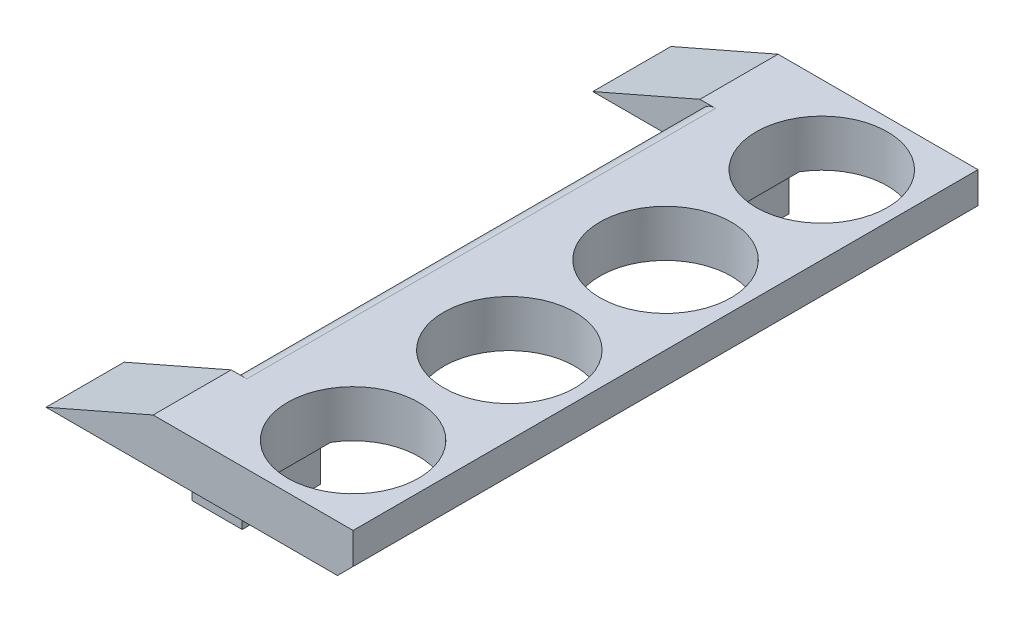
ISO-10303-21;
HEADER;
FILE_DESCRIPTION(('STEP AP214'),'2;1');
FILE_NAME('part.step','',(''),(''),'','','');
FILE_SCHEMA(('AUTOMOTIVE_DESIGN { 1 0 10303 214 1 1 1 1 }'));
ENDSEC;
DATA;
#1=APPLICATION_CONTEXT('core data for automotive mechanical design processes');
#2=APPLICATION_PROTOCOL_DEFINITION('international standard','automotive_design',2000,#1);
#3=PRODUCT_CONTEXT('',#1,'mechanical');
#4=PRODUCT('Part','Part','',(#3));
#5=PRODUCT_RELATED_PRODUCT_CATEGORY('part','',(#4));
#6=PRODUCT_DEFINITION_FORMATION('','',#4);
#7=PRODUCT_DEFINITION_CONTEXT('part definition',#1,'design');
#8=PRODUCT_DEFINITION('design','',#6,#7);
#9=PRODUCT_DEFINITION_SHAPE('','',#8);
#10=(LENGTH_UNIT() NAMED_UNIT(*) SI_UNIT(.MILLI.,.METRE.));
#11=(NAMED_UNIT(*) PLANE_ANGLE_UNIT() SI_UNIT($,.RADIAN.));
#12=(NAMED_UNIT(*) SI_UNIT($,.STERADIAN.) SOLID_ANGLE_UNIT());
#13=UNCERTAINTY_MEASURE_WITH_UNIT(LENGTH_MEASURE(1.E-05),#10,'distance_accuracy_value','');
#14=(GEOMETRIC_REPRESENTATION_CONTEXT(3) GLOBAL_UNCERTAINTY_ASSIGNED_CONTEXT((#13)) GLOBAL_UNIT_ASSIGNED_CONTEXT((#10,
#11,#12)) REPRESENTATION_CONTEXT('',''));
#15=CARTESIAN_POINT('',(0.,0.,0.));
#16=DIRECTION('',(0.,0.,1.));
#17=DIRECTION('',(1.,0.,0.));
#18=AXIS2_PLACEMENT_3D('',#15,#16,#17);
#19=CARTESIAN_POINT('',(0.,0.,0.));
#20=DIRECTION('',(0.,1.,0.));
#21=DIRECTION('',(0.,0.,1.));
#22=AXIS2_PLACEMENT_3D('',#19,#20,#21);
#23=PLANE('',#22);
#24=DIRECTION('',(-1.,0.,0.));
#25=VECTOR('',#24,1.);
#26=CARTESIAN_POINT('',(-32.,0.,-62.5));
#27=LINE('',#26,#25);
#28=CARTESIAN_POINT('',(-10.9999999999999,0.,-62.5));
#29=VERTEX_POINT('',#28);
#30=CARTESIAN_POINT('',(-32.,0.,-62.5));
#31=VERTEX_POINT('',#30);
#32=EDGE_CURVE('E232',#29,#31,#27,.T.);
#33=ORIENTED_EDGE('',*,*,#32,.F.);
#34=DIRECTION('',(0.,0.,-1.));
#35=VECTOR('',#34,1.);
#36=CARTESIAN_POINT('',(-10.9999999999999,0.,-87.5));
#37=LINE('',#36,#35);
#38=CARTESIAN_POINT('',(-10.9999999999999,0.,-64.1833461736079));
#39=VERTEX_POINT('',#38);
#40=EDGE_CURVE('E410',#29,#39,#37,.T.);
#41=ORIENTED_EDGE('',*,*,#40,.T.);
#42=CARTESIAN_POINT('',(6.99999999999999,0.,-75.));
#43=DIRECTION('',(0.,1.,0.));
#44=DIRECTION('',(0.,0.,1.));
#45=AXIS2_PLACEMENT_3D('',#42,#43,#44);
#46=CIRCLE('',#45,21.);
#47=CARTESIAN_POINT('',(27.,0.,-68.5968757625671));
#48=VERTEX_POINT('',#47);
#49=EDGE_CURVE('E286',#39,#48,#46,.T.);
#50=ORIENTED_EDGE('',*,*,#49,.T.);
#51=DIRECTION('',(0.,0.,1.));
#52=VECTOR('',#51,1.);
#53=CARTESIAN_POINT('',(27.,0.,0.));
#54=LINE('',#53,#52);
#55=CARTESIAN_POINT('',(27.,0.,-31.4031242374346));
#56=VERTEX_POINT('',#55);
#57=EDGE_CURVE('E368',#48,#56,#54,.T.);
#58=ORIENTED_EDGE('',*,*,#57,.T.);
#59=CARTESIAN_POINT('',(7.00000000000051,0.,-25.));
#60=DIRECTION('',(0.,1.,0.));
#61=DIRECTION('',(0.,0.,1.));
#62=AXIS2_PLACEMENT_3D('',#59,#60,#61);
#63=CIRCLE('',#62,21.);
#64=CARTESIAN_POINT('',(27.,0.,-18.5968757625655));
#65=VERTEX_POINT('',#64);
#66=EDGE_CURVE('E293',#56,#65,#63,.T.);
#67=ORIENTED_EDGE('',*,*,#66,.T.);
#68=DIRECTION('',(0.,0.,1.));
#69=VECTOR('',#68,1.);
#70=CARTESIAN_POINT('',(27.,0.,0.));
#71=LINE('',#70,#69);
#72=CARTESIAN_POINT('',(27.,0.,18.5968757625638));
#73=VERTEX_POINT('',#72);
#74=EDGE_CURVE('E366',#65,#73,#71,.T.);
#75=ORIENTED_EDGE('',*,*,#74,.T.);
#76=CARTESIAN_POINT('',(7.00000000000103,0.,25.));
#77=DIRECTION('',(0.,1.,0.));
#78=DIRECTION('',(0.,0.,1.));
#79=AXIS2_PLACEMENT_3D('',#76,#77,#78);
#80=CIRCLE('',#79,21.);
#81=CARTESIAN_POINT('',(27.,0.,31.4031242374362));
#82=VERTEX_POINT('',#81);
#83=EDGE_CURVE('E299',#73,#82,#80,.T.);
#84=ORIENTED_EDGE('',*,*,#83,.T.);
#85=DIRECTION('',(0.,0.,1.));
#86=VECTOR('',#85,1.);
#87=CARTESIAN_POINT('',(27.,0.,0.));
#88=LINE('',#87,#86);
#89=CARTESIAN_POINT('',(27.,0.,68.5968757625621));
#90=VERTEX_POINT('',#89);
#91=EDGE_CURVE('E364',#82,#90,#88,.T.);
#92=ORIENTED_EDGE('',*,*,#91,.T.);
#93=CARTESIAN_POINT('',(7.00000000000155,0.,75.));
#94=DIRECTION('',(0.,1.,0.));
#95=DIRECTION('',(0.,0.,1.));
#96=AXIS2_PLACEMENT_3D('',#93,#94,#95);
#97=CIRCLE('',#96,21.);
#98=CARTESIAN_POINT('',(-10.9999999999999,0.,64.1833461736105));
#99=VERTEX_POINT('',#98);
#100=EDGE_CURVE('E305',#90,#99,#97,.T.);
#101=ORIENTED_EDGE('',*,*,#100,.T.);
#102=DIRECTION('',(0.,0.,-1.));
#103=VECTOR('',#102,1.);
#104=CARTESIAN_POINT('',(-10.9999999999999,0.,62.5));
#105=LINE('',#104,#103);
#106=CARTESIAN_POINT('',(-10.9999999999999,0.,62.5));
#107=VERTEX_POINT('',#106);
#108=EDGE_CURVE('E402',#99,#107,#105,.T.);
#109=ORIENTED_EDGE('',*,*,#108,.T.);
#110=DIRECTION('',(1.,0.,0.));
#111=VECTOR('',#110,1.);
#112=CARTESIAN_POINT('',(-32.,0.,62.5));
#113=LINE('',#112,#111);
#114=CARTESIAN_POINT('',(-32.,0.,62.5));
#115=VERTEX_POINT('',#114);
#116=EDGE_CURVE('E261',#115,#107,#113,.T.);
#117=ORIENTED_EDGE('',*,*,#116,.F.);
#118=DIRECTION('',(0.,0.,-1.));
#119=VECTOR('',#118,1.);
#120=CARTESIAN_POINT('',(-32.,0.,0.));
#121=LINE('',#120,#119);
#122=EDGE_CURVE('E333',#115,#31,#121,.T.);
#123=ORIENTED_EDGE('',*,*,#122,.T.);
#124=EDGE_LOOP('',(#33,#41,#50,#58,#67,#75,#84,#92,#101,#109,#117,#123));
#125=FACE_BOUND('',#124,.T.);
#126=ADVANCED_FACE('F37',(#125),#23,.F.);
#127=DIRECTION('',(-1.,0.,0.));
#128=VECTOR('',#127,1.);
#129=CARTESIAN_POINT('',(-32.,0.,87.5));
#130=LINE('',#129,#128);
#131=CARTESIAN_POINT('',(-10.9999999999999,0.,87.5));
#132=VERTEX_POINT('',#131);
#133=CARTESIAN_POINT('',(-32.,0.,87.5));
#134=VERTEX_POINT('',#133);
#135=EDGE_CURVE('E252',#132,#134,#130,.T.);
#136=ORIENTED_EDGE('',*,*,#135,.F.);
#137=DIRECTION('',(0.,0.,-1.));
#138=VECTOR('',#137,1.);
#139=CARTESIAN_POINT('',(-10.9999999999999,0.,62.5));
#140=LINE('',#139,#138);
#141=CARTESIAN_POINT('',(-10.9999999999999,0.,85.8166538263895));
#142=VERTEX_POINT('',#141);
#143=EDGE_CURVE('E405',#132,#142,#140,.T.);
#144=ORIENTED_EDGE('',*,*,#143,.T.);
#145=CARTESIAN_POINT('',(27.,0.,81.4031242374378));
#146=VERTEX_POINT('',#145);
#147=EDGE_CURVE('E279',#142,#146,#97,.T.);
#148=ORIENTED_EDGE('',*,*,#147,.T.);
#149=DIRECTION('',(0.,0.,1.));
#150=VECTOR('',#149,1.);
#151=CARTESIAN_POINT('',(27.,0.,0.));
#152=LINE('',#151,#150);
#153=CARTESIAN_POINT('',(27.,0.,100.));
#154=VERTEX_POINT('',#153);
#155=EDGE_CURVE('E362',#146,#154,#152,.T.);
#156=ORIENTED_EDGE('',*,*,#155,.T.);
#157=DIRECTION('',(1.,0.,0.));
#158=VECTOR('',#157,1.);
#159=CARTESIAN_POINT('',(0.,0.,100.));
#160=LINE('',#159,#158);
#161=CARTESIAN_POINT('',(-66.2855116428816,0.,100.));
#162=VERTEX_POINT('',#161);
#163=EDGE_CURVE('E344',#162,#154,#160,.T.);
#164=ORIENTED_EDGE('',*,*,#163,.F.);
#165=DIRECTION('',(0.,0.,-1.));
#166=VECTOR('',#165,1.);
#167=CARTESIAN_POINT('',(-66.2855116428816,0.,0.));
#168=LINE('',#167,#166);
#169=CARTESIAN_POINT('',(-66.2855116428816,0.,75.));
#170=VERTEX_POINT('',#169);
#171=EDGE_CURVE('E311',#162,#170,#168,.T.);
#172=ORIENTED_EDGE('',*,*,#171,.T.);
#173=DIRECTION('',(-1.,0.,0.));
#174=VECTOR('',#173,1.);
#175=CARTESIAN_POINT('',(0.,0.,75.));
#176=LINE('',#175,#174);
#177=CARTESIAN_POINT('',(-32.,0.,75.));
#178=VERTEX_POINT('',#177);
#179=EDGE_CURVE('E323',#178,#170,#176,.T.);
#180=ORIENTED_EDGE('',*,*,#179,.F.);
#181=DIRECTION('',(0.,0.,-1.));
#182=VECTOR('',#181,1.);
#183=CARTESIAN_POINT('',(-32.,0.,87.5));
#184=LINE('',#183,#182);
#185=EDGE_CURVE('E242',#134,#178,#184,.T.);
#186=ORIENTED_EDGE('',*,*,#185,.F.);
#187=EDGE_LOOP('',(#136,#144,#148,#156,#164,#172,#180,#186));
#188=FACE_BOUND('',#187,.T.);
#189=ADVANCED_FACE('F456',(#188),#23,.F.);
#190=CARTESIAN_POINT('',(-27.,10.,0.));
#191=DIRECTION('',(0.,0.,1.));
#192=DIRECTION('',(1.,0.,0.));
#193=AXIS2_PLACEMENT_3D('',#190,#191,#192);
#194=CYLINDRICAL_SURFACE('',#193,5.);
#195=DIRECTION('',(0.,0.,1.));
#196=VECTOR('',#195,1.);
#197=CARTESIAN_POINT('',(-27.,15.,0.));
#198=LINE('',#197,#196);
#199=CARTESIAN_POINT('',(-27.,15.,-75.));
#200=VERTEX_POINT('',#199);
#201=CARTESIAN_POINT('',(-27.,15.,75.));
#202=VERTEX_POINT('',#201);
#203=EDGE_CURVE('E386',#200,#202,#198,.T.);
#204=ORIENTED_EDGE('',*,*,#203,.F.);
#205=CARTESIAN_POINT('',(-27.,10.,-75.));
#206=DIRECTION('',(0.,0.,1.));
#207=DIRECTION('',(1.,0.,0.));
#208=AXIS2_PLACEMENT_3D('',#205,#206,#207);
#209=CIRCLE('',#208,5.);
#210=CARTESIAN_POINT('',(-32.,10.,-75.));
#211=VERTEX_POINT('',#210);
#212=EDGE_CURVE('E395',#200,#211,#209,.T.);
#213=ORIENTED_EDGE('',*,*,#212,.T.);
#214=DIRECTION('',(0.,0.,1.));
#215=VECTOR('',#214,1.);
#216=CARTESIAN_POINT('',(-32.,10.,0.));
#217=LINE('',#216,#215);
#218=CARTESIAN_POINT('',(-32.,10.,75.));
#219=VERTEX_POINT('',#218);
#220=EDGE_CURVE('E392',#219,#211,#217,.F.);
#221=ORIENTED_EDGE('',*,*,#220,.F.);
#222=CARTESIAN_POINT('',(-27.,10.,75.));
#223=DIRECTION('',(0.,0.,1.));
#224=DIRECTION('',(1.,0.,0.));
#225=AXIS2_PLACEMENT_3D('',#222,#223,#224);
#226=CIRCLE('',#225,5.);
#227=EDGE_CURVE('E397',#219,#202,#226,.F.);
#228=ORIENTED_EDGE('',*,*,#227,.T.);
#229=EDGE_LOOP('',(#204,#213,#221,#228));
#230=FACE_BOUND('',#229,.T.);
#231=ADVANCED_FACE('F462',(#230),#194,.T.);
#232=CARTESIAN_POINT('',(27.,0.,-81.403124237433));
#233=VERTEX_POINT('',#232);
#234=CARTESIAN_POINT('',(-10.9999999999999,0.,-85.8166538263922));
#235=VERTEX_POINT('',#234);
#236=EDGE_CURVE('E282',#233,#235,#46,.T.);
#237=ORIENTED_EDGE('',*,*,#236,.T.);
#238=DIRECTION('',(0.,0.,-1.));
#239=VECTOR('',#238,1.);
#240=CARTESIAN_POINT('',(-10.9999999999999,0.,-87.5));
#241=LINE('',#240,#239);
#242=CARTESIAN_POINT('',(-10.9999999999999,0.,-87.5));
#243=VERTEX_POINT('',#242);
#244=EDGE_CURVE('E407',#235,#243,#241,.T.);
#245=ORIENTED_EDGE('',*,*,#244,.T.);
#246=DIRECTION('',(1.,0.,0.));
#247=VECTOR('',#246,1.);
#248=CARTESIAN_POINT('',(-31.9999999999999,0.,-87.5));
#249=LINE('',#248,#247);
#250=CARTESIAN_POINT('',(-31.9999999999999,0.,-87.5));
#251=VERTEX_POINT('',#250);
#252=EDGE_CURVE('E487',#251,#243,#249,.T.);
#253=ORIENTED_EDGE('',*,*,#252,.F.);
#254=DIRECTION('',(0.,0.,-1.));
#255=VECTOR('',#254,1.);
#256=CARTESIAN_POINT('',(-31.9999999999999,0.,-87.5));
#257=LINE('',#256,#255);
#258=CARTESIAN_POINT('',(-32.,0.,-75.));
#259=VERTEX_POINT('',#258);
#260=EDGE_CURVE('E238',#259,#251,#257,.T.);
#261=ORIENTED_EDGE('',*,*,#260,.F.);
#262=DIRECTION('',(-1.,0.,0.));
#263=VECTOR('',#262,1.);
#264=CARTESIAN_POINT('',(0.,0.,-75.));
#265=LINE('',#264,#263);
#266=CARTESIAN_POINT('',(-66.2855116428816,0.,-75.));
#267=VERTEX_POINT('',#266);
#268=EDGE_CURVE('E328',#259,#267,#265,.T.);
#269=ORIENTED_EDGE('',*,*,#268,.T.);
#270=CARTESIAN_POINT('',(-66.2855116428816,0.,-100.));
#271=VERTEX_POINT('',#270);
#272=EDGE_CURVE('E315',#267,#271,#168,.T.);
#273=ORIENTED_EDGE('',*,*,#272,.T.);
#274=DIRECTION('',(1.,0.,0.));
#275=VECTOR('',#274,1.);
#276=CARTESIAN_POINT('',(0.,0.,-100.));
#277=LINE('',#276,#275);
#278=CARTESIAN_POINT('',(27.,0.,-100.));
#279=VERTEX_POINT('',#278);
#280=EDGE_CURVE('E337',#271,#279,#277,.T.);
#281=ORIENTED_EDGE('',*,*,#280,.T.);
#282=DIRECTION('',(0.,0.,1.));
#283=VECTOR('',#282,1.);
#284=CARTESIAN_POINT('',(27.,0.,0.));
#285=LINE('',#284,#283);
#286=EDGE_CURVE('E370',#279,#233,#285,.T.);
#287=ORIENTED_EDGE('',*,*,#286,.T.);
#288=EDGE_LOOP('',(#237,#245,#253,#261,#269,#273,#281,#287));
#289=FACE_BOUND('',#288,.T.);
#290=ADVANCED_FACE('F458',(#289),#23,.F.);
#291=CARTESIAN_POINT('',(-32.,15.,0.));
#292=DIRECTION('',(-1.,0.,0.));
#293=DIRECTION('',(0.,0.,1.));
#294=AXIS2_PLACEMENT_3D('',#291,#292,#293);
#295=PLANE('',#294);
#296=DIRECTION('',(0.,-1.,0.));
#297=VECTOR('',#296,1.);
#298=CARTESIAN_POINT('',(-32.,15.,75.));
#299=LINE('',#298,#297);
#300=EDGE_CURVE('E326',#219,#178,#299,.T.);
#301=ORIENTED_EDGE('',*,*,#300,.F.);
#302=ORIENTED_EDGE('',*,*,#220,.T.);
#303=DIRECTION('',(0.,-1.,0.));
#304=VECTOR('',#303,1.);
#305=CARTESIAN_POINT('',(-32.,15.,-75.));
#306=LINE('',#305,#304);
#307=EDGE_CURVE('E331',#211,#259,#306,.T.);
#308=ORIENTED_EDGE('',*,*,#307,.T.);
#309=ORIENTED_EDGE('',*,*,#260,.T.);
#310=DIRECTION('',(0.,1.,0.));
#311=VECTOR('',#310,1.);
#312=CARTESIAN_POINT('',(-31.9999999999999,-15.,-87.5));
#313=LINE('',#312,#311);
#314=CARTESIAN_POINT('',(-31.9999999999999,-15.,-87.5));
#315=VERTEX_POINT('',#314);
#316=EDGE_CURVE('E216',#315,#251,#313,.T.);
#317=ORIENTED_EDGE('',*,*,#316,.F.);
#318=DIRECTION('',(0.,0.,-1.));
#319=VECTOR('',#318,1.);
#320=CARTESIAN_POINT('',(-31.9999999999999,-15.,-87.5));
#321=LINE('',#320,#319);
#322=CARTESIAN_POINT('',(-32.,-15.,-62.5));
#323=VERTEX_POINT('',#322);
#324=EDGE_CURVE('E222',#323,#315,#321,.T.);
#325=ORIENTED_EDGE('',*,*,#324,.F.);
#326=DIRECTION('',(0.,1.,0.));
#327=VECTOR('',#326,1.);
#328=CARTESIAN_POINT('',(-32.,-15.,-62.5));
#329=LINE('',#328,#327);
#330=EDGE_CURVE('E493',#323,#31,#329,.T.);
#331=ORIENTED_EDGE('',*,*,#330,.T.);
#332=ORIENTED_EDGE('',*,*,#122,.F.);
#333=DIRECTION('',(0.,1.,0.));
#334=VECTOR('',#333,1.);
#335=CARTESIAN_POINT('',(-32.,-15.,62.5));
#336=LINE('',#335,#334);
#337=CARTESIAN_POINT('',(-32.,-15.,62.5));
#338=VERTEX_POINT('',#337);
#339=EDGE_CURVE('E272',#338,#115,#336,.T.);
#340=ORIENTED_EDGE('',*,*,#339,.F.);
#341=DIRECTION('',(0.,0.,-1.));
#342=VECTOR('',#341,1.);
#343=CARTESIAN_POINT('',(-32.,-15.,87.5));
#344=LINE('',#343,#342);
#345=CARTESIAN_POINT('',(-32.,-15.,87.5));
#346=VERTEX_POINT('',#345);
#347=EDGE_CURVE('E248',#346,#338,#344,.T.);
#348=ORIENTED_EDGE('',*,*,#347,.F.);
#349=DIRECTION('',(0.,1.,0.));
#350=VECTOR('',#349,1.);
#351=CARTESIAN_POINT('',(-32.,-15.,87.5));
#352=LINE('',#351,#350);
#353=EDGE_CURVE('E258',#346,#134,#352,.T.);
#354=ORIENTED_EDGE('',*,*,#353,.T.);
#355=ORIENTED_EDGE('',*,*,#185,.T.);
#356=EDGE_LOOP('',(#301,#302,#308,#309,#317,#325,#331,#332,#340,#348,#354,#355));
#357=FACE_BOUND('',#356,.T.);
#358=ADVANCED_FACE('F236',(#357),#295,.T.);
#359=CARTESIAN_POINT('',(0.,15.,100.));
#360=DIRECTION('',(0.,0.,-1.));
#361=DIRECTION('',(-1.,0.,0.));
#362=AXIS2_PLACEMENT_3D('',#359,#360,#361);
#363=PLANE('',#362);
#364=ORIENTED_EDGE('',*,*,#163,.T.);
#365=DIRECTION('',(-0.707106781186549,-0.707106781186546,0.));
#366=VECTOR('',#365,1.);
#367=CARTESIAN_POINT('',(32.,5.,100.));
#368=LINE('',#367,#366);
#369=CARTESIAN_POINT('',(32.,5.,100.));
#370=VERTEX_POINT('',#369);
#371=EDGE_CURVE('E382',#154,#370,#368,.F.);
#372=ORIENTED_EDGE('',*,*,#371,.T.);
#373=DIRECTION('',(0.,-1.,0.));
#374=VECTOR('',#373,1.);
#375=CARTESIAN_POINT('',(32.,15.,100.));
#376=LINE('',#375,#374);
#377=CARTESIAN_POINT('',(32.,15.,100.));
#378=VERTEX_POINT('',#377);
#379=EDGE_CURVE('E351',#378,#370,#376,.T.);
#380=ORIENTED_EDGE('',*,*,#379,.F.);
#381=DIRECTION('',(1.,0.,0.));
#382=VECTOR('',#381,1.);
#383=CARTESIAN_POINT('',(0.,15.,100.));
#384=LINE('',#383,#382);
#385=CARTESIAN_POINT('',(-32.,15.,99.9999999999999));
#386=VERTEX_POINT('',#385);
#387=EDGE_CURVE('E334',#386,#378,#384,.T.);
#388=ORIENTED_EDGE('',*,*,#387,.F.);
#389=DIRECTION('',(-0.916156464965632,-0.400820822440247,0.));
#390=VECTOR('',#389,1.);
#391=CARTESIAN_POINT('',(-5.14103461445364,26.7508668086872,100.));
#392=LINE('',#391,#390);
#393=EDGE_CURVE('E314',#386,#162,#392,.T.);
#394=ORIENTED_EDGE('',*,*,#393,.T.);
#395=EDGE_LOOP('',(#364,#372,#380,#388,#394));
#396=FACE_BOUND('',#395,.T.);
#397=ADVANCED_FACE('F472',(#396),#363,.F.);
#398=CARTESIAN_POINT('',(32.,15.,0.));
#399=DIRECTION('',(-1.,0.,0.));
#400=DIRECTION('',(0.,0.,1.));
#401=AXIS2_PLACEMENT_3D('',#398,#399,#400);
#402=PLANE('',#401);
#403=ORIENTED_EDGE('',*,*,#379,.T.);
#404=DIRECTION('',(0.,0.,-1.));
#405=VECTOR('',#404,1.);
#406=CARTESIAN_POINT('',(32.,5.,0.));
#407=LINE('',#406,#405);
#408=CARTESIAN_POINT('',(32.,5.,-100.));
#409=VERTEX_POINT('',#408);
#410=EDGE_CURVE('E357',#370,#409,#407,.T.);
#411=ORIENTED_EDGE('',*,*,#410,.T.);
#412=DIRECTION('',(0.,-1.,0.));
#413=VECTOR('',#412,1.);
#414=CARTESIAN_POINT('',(32.,15.,-100.));
#415=LINE('',#414,#413);
#416=CARTESIAN_POINT('',(32.,15.,-100.));
#417=VERTEX_POINT('',#416);
#418=EDGE_CURVE('E342',#417,#409,#415,.T.);
#419=ORIENTED_EDGE('',*,*,#418,.F.);
#420=DIRECTION('',(0.,0.,-1.));
#421=VECTOR('',#420,1.);
#422=CARTESIAN_POINT('',(32.,15.,0.));
#423=LINE('',#422,#421);
#424=EDGE_CURVE('E336',#378,#417,#423,.T.);
#425=ORIENTED_EDGE('',*,*,#424,.F.);
#426=EDGE_LOOP('',(#403,#411,#419,#425));
#427=FACE_BOUND('',#426,.T.);
#428=ADVANCED_FACE('F544',(#427),#402,.F.);
#429=CARTESIAN_POINT('',(0.,15.,-100.));
#430=DIRECTION('',(0.,0.,-1.));
#431=DIRECTION('',(-1.,0.,0.));
#432=AXIS2_PLACEMENT_3D('',#429,#430,#431);
#433=PLANE('',#432);
#434=ORIENTED_EDGE('',*,*,#418,.T.);
#435=DIRECTION('',(0.707106781186549,0.707106781186546,0.));
#436=VECTOR('',#435,1.);
#437=CARTESIAN_POINT('',(20.9999999999999,-6.00000000000002,-100.));
#438=LINE('',#437,#436);
#439=EDGE_CURVE('E360',#409,#279,#438,.F.);
#440=ORIENTED_EDGE('',*,*,#439,.T.);
#441=ORIENTED_EDGE('',*,*,#280,.F.);
#442=DIRECTION('',(-0.916156464965632,-0.400820822440247,0.));
#443=VECTOR('',#442,1.);
#444=CARTESIAN_POINT('',(-5.14103461445364,26.7508668086872,-100.));
#445=LINE('',#444,#443);
#446=CARTESIAN_POINT('',(-32.,15.,-100.));
#447=VERTEX_POINT('',#446);
#448=EDGE_CURVE('E321',#447,#271,#445,.T.);
#449=ORIENTED_EDGE('',*,*,#448,.F.);
#450=DIRECTION('',(1.,0.,0.));
#451=VECTOR('',#450,1.);
#452=CARTESIAN_POINT('',(0.,15.,-100.));
#453=LINE('',#452,#451);
#454=EDGE_CURVE('E340',#447,#417,#453,.T.);
#455=ORIENTED_EDGE('',*,*,#454,.T.);
#456=EDGE_LOOP('',(#434,#440,#441,#449,#455));
#457=FACE_BOUND('',#456,.T.);
#458=ADVANCED_FACE('F524',(#457),#433,.T.);
#459=CARTESIAN_POINT('',(0.,15.,0.));
#460=DIRECTION('',(0.,1.,0.));
#461=DIRECTION('',(0.,0.,1.));
#462=AXIS2_PLACEMENT_3D('',#459,#460,#461);
#463=PLANE('',#462);
#464=CARTESIAN_POINT('',(6.99999999999999,15.,-75.));
#465=DIRECTION('',(0.,1.,0.));
#466=DIRECTION('',(0.,0.,1.));
#467=AXIS2_PLACEMENT_3D('',#464,#465,#466);
#468=CIRCLE('',#467,21.);
#469=CARTESIAN_POINT('',(6.99999999999999,15.,-54.));
#470=VERTEX_POINT('',#469);
#471=EDGE_CURVE('E287',#470,#470,#468,.T.);
#472=ORIENTED_EDGE('',*,*,#471,.F.);
#473=EDGE_LOOP('',(#472));
#474=FACE_BOUND('',#473,.T.);
#475=CARTESIAN_POINT('',(7.00000000000051,15.,-25.));
#476=DIRECTION('',(0.,1.,0.));
#477=DIRECTION('',(0.,0.,1.));
#478=AXIS2_PLACEMENT_3D('',#475,#476,#477);
#479=CIRCLE('',#478,21.);
#480=CARTESIAN_POINT('',(7.00000000000051,15.,-4.00000000000003));
#481=VERTEX_POINT('',#480);
#482=EDGE_CURVE('E290',#481,#481,#479,.T.);
#483=ORIENTED_EDGE('',*,*,#482,.F.);
#484=EDGE_LOOP('',(#483));
#485=FACE_BOUND('',#484,.T.);
#486=CARTESIAN_POINT('',(7.00000000000103,15.,25.));
#487=DIRECTION('',(0.,1.,0.));
#488=DIRECTION('',(0.,0.,1.));
#489=AXIS2_PLACEMENT_3D('',#486,#487,#488);
#490=CIRCLE('',#489,21.);
#491=CARTESIAN_POINT('',(7.00000000000103,15.,46.));
#492=VERTEX_POINT('',#491);
#493=EDGE_CURVE('E296',#492,#492,#490,.T.);
#494=ORIENTED_EDGE('',*,*,#493,.F.);
#495=EDGE_LOOP('',(#494));
#496=FACE_BOUND('',#495,.T.);
#497=CARTESIAN_POINT('',(7.00000000000155,15.,75.));
#498=DIRECTION('',(0.,1.,0.));
#499=DIRECTION('',(0.,0.,1.));
#500=AXIS2_PLACEMENT_3D('',#497,#498,#499);
#501=CIRCLE('',#500,21.);
#502=CARTESIAN_POINT('',(7.00000000000155,15.,96.));
#503=VERTEX_POINT('',#502);
#504=EDGE_CURVE('E302',#503,#503,#501,.T.);
#505=ORIENTED_EDGE('',*,*,#504,.F.);
#506=EDGE_LOOP('',(#505));
#507=FACE_BOUND('',#506,.T.);
#508=DIRECTION('',(0.,0.,1.));
#509=VECTOR('',#508,1.);
#510=CARTESIAN_POINT('',(-32.,15.,-135.));
#511=LINE('',#510,#509);
#512=CARTESIAN_POINT('',(-32.,15.,-75.));
#513=VERTEX_POINT('',#512);
#514=EDGE_CURVE('E310',#447,#513,#511,.T.);
#515=ORIENTED_EDGE('',*,*,#514,.T.);
#516=DIRECTION('',(1.,0.,0.));
#517=VECTOR('',#516,1.);
#518=CARTESIAN_POINT('',(0.,15.,-75.));
#519=LINE('',#518,#517);
#520=EDGE_CURVE('E389',#513,#200,#519,.T.);
#521=ORIENTED_EDGE('',*,*,#520,.T.);
#522=ORIENTED_EDGE('',*,*,#203,.T.);
#523=DIRECTION('',(-1.,0.,0.));
#524=VECTOR('',#523,1.);
#525=CARTESIAN_POINT('',(0.,15.,75.));
#526=LINE('',#525,#524);
#527=CARTESIAN_POINT('',(-32.,15.,75.));
#528=VERTEX_POINT('',#527);
#529=EDGE_CURVE('E384',#202,#528,#526,.T.);
#530=ORIENTED_EDGE('',*,*,#529,.T.);
#531=EDGE_CURVE('E285',#528,#386,#511,.T.);
#532=ORIENTED_EDGE('',*,*,#531,.T.);
#533=ORIENTED_EDGE('',*,*,#387,.T.);
#534=ORIENTED_EDGE('',*,*,#424,.T.);
#535=ORIENTED_EDGE('',*,*,#454,.F.);
#536=EDGE_LOOP('',(#515,#521,#522,#530,#532,#533,#534,#535));
#537=FACE_BOUND('',#536,.T.);
#538=ADVANCED_FACE('F520',(#474,#485,#496,#507,#537),#463,.T.);
#539=CARTESIAN_POINT('',(0.,15.,-75.));
#540=DIRECTION('',(0.,0.,1.));
#541=DIRECTION('',(1.,0.,0.));
#542=AXIS2_PLACEMENT_3D('',#539,#540,#541);
#543=PLANE('',#542);
#544=DIRECTION('',(0.916156464965632,0.400820822440247,0.));
#545=VECTOR('',#544,1.);
#546=CARTESIAN_POINT('',(-5.14103461445367,26.7508668086872,-75.));
#547=LINE('',#546,#545);
#548=EDGE_CURVE('E318',#267,#513,#547,.T.);
#549=ORIENTED_EDGE('',*,*,#548,.F.);
#550=ORIENTED_EDGE('',*,*,#268,.F.);
#551=ORIENTED_EDGE('',*,*,#307,.F.);
#552=ORIENTED_EDGE('',*,*,#212,.F.);
#553=ORIENTED_EDGE('',*,*,#520,.F.);
#554=EDGE_LOOP('',(#549,#550,#551,#552,#553));
#555=FACE_BOUND('',#554,.T.);
#556=ADVANCED_FACE('F523',(#555),#543,.T.);
#557=CARTESIAN_POINT('',(0.,15.,75.));
#558=DIRECTION('',(0.,0.,1.));
#559=DIRECTION('',(1.,0.,0.));
#560=AXIS2_PLACEMENT_3D('',#557,#558,#559);
#561=PLANE('',#560);
#562=ORIENTED_EDGE('',*,*,#179,.T.);
#563=DIRECTION('',(0.916156464965632,0.400820822440247,0.));
#564=VECTOR('',#563,1.);
#565=CARTESIAN_POINT('',(-5.14103461445364,26.7508668086872,75.));
#566=LINE('',#565,#564);
#567=EDGE_CURVE('E354',#170,#528,#566,.T.);
#568=ORIENTED_EDGE('',*,*,#567,.T.);
#569=ORIENTED_EDGE('',*,*,#529,.F.);
#570=ORIENTED_EDGE('',*,*,#227,.F.);
#571=ORIENTED_EDGE('',*,*,#300,.T.);
#572=EDGE_LOOP('',(#562,#568,#569,#570,#571));
#573=FACE_BOUND('',#572,.T.);
#574=ADVANCED_FACE('F555',(#573),#561,.F.);
#575=CARTESIAN_POINT('',(-32.,15.,-135.));
#576=DIRECTION('',(0.400820822440247,-0.916156464965632,0.));
#577=DIRECTION('',(0.916156464965632,0.400820822440247,0.));
#578=AXIS2_PLACEMENT_3D('',#575,#576,#577);
#579=PLANE('',#578);
#580=ORIENTED_EDGE('',*,*,#531,.F.);
#581=ORIENTED_EDGE('',*,*,#567,.F.);
#582=ORIENTED_EDGE('',*,*,#171,.F.);
#583=ORIENTED_EDGE('',*,*,#393,.F.);
#584=EDGE_LOOP('',(#580,#581,#582,#583));
#585=FACE_BOUND('',#584,.T.);
#586=ADVANCED_FACE('F559',(#585),#579,.F.);
#587=ORIENTED_EDGE('',*,*,#448,.T.);
#588=ORIENTED_EDGE('',*,*,#272,.F.);
#589=ORIENTED_EDGE('',*,*,#548,.T.);
#590=ORIENTED_EDGE('',*,*,#514,.F.);
#591=EDGE_LOOP('',(#587,#588,#589,#590));
#592=FACE_BOUND('',#591,.T.);
#593=ADVANCED_FACE('F535',(#592),#579,.F.);
#594=CARTESIAN_POINT('',(7.00000000000155,0.,75.));
#595=DIRECTION('',(0.,1.,0.));
#596=DIRECTION('',(0.,0.,1.));
#597=AXIS2_PLACEMENT_3D('',#594,#595,#596);
#598=CYLINDRICAL_SURFACE('',#597,21.);
#599=ORIENTED_EDGE('',*,*,#100,.F.);
#600=CARTESIAN_POINT('',(7.00000000000155,-19.9999999999983,75.));
#601=DIRECTION('',(-0.707106781186545,0.707106781186549,0.));
#602=DIRECTION('',(0.707106781186549,0.707106781186546,0.));
#603=AXIS2_PLACEMENT_3D('',#600,#601,#602);
#604=ELLIPSE('',#603,29.6984848098349,21.);
#605=EDGE_CURVE('E379',#90,#146,#604,.F.);
#606=ORIENTED_EDGE('',*,*,#605,.T.);
#607=ORIENTED_EDGE('',*,*,#147,.F.);
#608=CARTESIAN_POINT('',(7.00000000000155,18.0000000000017,75.));
#609=DIRECTION('',(0.707106781186551,-0.707106781186544,0.));
#610=DIRECTION('',(0.707106781186544,0.707106781186551,0.));
#611=AXIS2_PLACEMENT_3D('',#608,#609,#610);
#612=ELLIPSE('',#611,29.6984848098352,21.);
#613=EDGE_CURVE('E46',#142,#99,#612,.T.);
#614=ORIENTED_EDGE('',*,*,#613,.T.);
#615=EDGE_LOOP('',(#599,#606,#607,#614));
#616=FACE_BOUND('',#615,.T.);
#617=ORIENTED_EDGE('',*,*,#504,.T.);
#618=EDGE_LOOP('',(#617));
#619=FACE_BOUND('',#618,.T.);
#620=ADVANCED_FACE('F425',(#616,#619),#598,.F.);
#621=CARTESIAN_POINT('',(7.00000000000103,0.,25.));
#622=DIRECTION('',(0.,1.,0.));
#623=DIRECTION('',(0.,0.,1.));
#624=AXIS2_PLACEMENT_3D('',#621,#622,#623);
#625=CYLINDRICAL_SURFACE('',#624,21.);
#626=ORIENTED_EDGE('',*,*,#83,.F.);
#627=CARTESIAN_POINT('',(7.00000000000103,-19.9999999999988,25.));
#628=DIRECTION('',(-0.707106781186545,0.707106781186549,0.));
#629=DIRECTION('',(0.707106781186549,0.707106781186546,0.));
#630=AXIS2_PLACEMENT_3D('',#627,#628,#629);
#631=ELLIPSE('',#630,29.6984848098349,21.);
#632=EDGE_CURVE('E377',#73,#82,#631,.F.);
#633=ORIENTED_EDGE('',*,*,#632,.T.);
#634=EDGE_LOOP('',(#626,#633));
#635=FACE_BOUND('',#634,.T.);
#636=ORIENTED_EDGE('',*,*,#493,.T.);
#637=EDGE_LOOP('',(#636));
#638=FACE_BOUND('',#637,.T.);
#639=ADVANCED_FACE('F516',(#635,#638),#625,.F.);
#640=CARTESIAN_POINT('',(7.00000000000051,0.,-25.));
#641=DIRECTION('',(0.,1.,0.));
#642=DIRECTION('',(0.,0.,1.));
#643=AXIS2_PLACEMENT_3D('',#640,#641,#642);
#644=CYLINDRICAL_SURFACE('',#643,21.);
#645=ORIENTED_EDGE('',*,*,#66,.F.);
#646=CARTESIAN_POINT('',(7.00000000000051,-19.9999999999993,-25.));
#647=DIRECTION('',(-0.707106781186545,0.707106781186549,0.));
#648=DIRECTION('',(0.707106781186549,0.707106781186546,0.));
#649=AXIS2_PLACEMENT_3D('',#646,#647,#648);
#650=ELLIPSE('',#649,29.6984848098349,21.);
#651=EDGE_CURVE('E375',#56,#65,#650,.F.);
#652=ORIENTED_EDGE('',*,*,#651,.T.);
#653=EDGE_LOOP('',(#645,#652));
#654=FACE_BOUND('',#653,.T.);
#655=ORIENTED_EDGE('',*,*,#482,.T.);
#656=EDGE_LOOP('',(#655));
#657=FACE_BOUND('',#656,.T.);
#658=ADVANCED_FACE('F513',(#654,#657),#644,.F.);
#659=CARTESIAN_POINT('',(6.99999999999999,0.,-75.));
#660=DIRECTION('',(0.,1.,0.));
#661=DIRECTION('',(0.,0.,1.));
#662=AXIS2_PLACEMENT_3D('',#659,#660,#661);
#663=CYLINDRICAL_SURFACE('',#662,21.);
#664=ORIENTED_EDGE('',*,*,#236,.F.);
#665=CARTESIAN_POINT('',(6.99999999999999,-19.9999999999999,-75.));
#666=DIRECTION('',(-0.707106781186545,0.707106781186549,0.));
#667=DIRECTION('',(0.707106781186549,0.707106781186546,0.));
#668=AXIS2_PLACEMENT_3D('',#665,#666,#667);
#669=ELLIPSE('',#668,29.6984848098349,21.);
#670=EDGE_CURVE('E372',#233,#48,#669,.F.);
#671=ORIENTED_EDGE('',*,*,#670,.T.);
#672=ORIENTED_EDGE('',*,*,#49,.F.);
#673=CARTESIAN_POINT('',(6.99999999999999,18.0000000000001,-75.));
#674=DIRECTION('',(0.707106781186551,-0.707106781186544,0.));
#675=DIRECTION('',(0.707106781186544,0.707106781186551,0.));
#676=AXIS2_PLACEMENT_3D('',#673,#674,#675);
#677=ELLIPSE('',#676,29.6984848098352,21.);
#678=EDGE_CURVE('E417',#39,#235,#677,.T.);
#679=ORIENTED_EDGE('',*,*,#678,.T.);
#680=EDGE_LOOP('',(#664,#671,#672,#679));
#681=FACE_BOUND('',#680,.T.);
#682=ORIENTED_EDGE('',*,*,#471,.T.);
#683=EDGE_LOOP('',(#682));
#684=FACE_BOUND('',#683,.T.);
#685=ADVANCED_FACE('F452',(#681,#684),#663,.F.);
#686=CARTESIAN_POINT('',(0.,-15.,0.));
#687=DIRECTION('',(0.,-1.,0.));
#688=DIRECTION('',(0.,0.,-1.));
#689=AXIS2_PLACEMENT_3D('',#686,#687,#688);
#690=PLANE('',#689);
#691=ORIENTED_EDGE('',*,*,#347,.T.);
#692=DIRECTION('',(1.,0.,0.));
#693=VECTOR('',#692,1.);
#694=CARTESIAN_POINT('',(-32.,-15.,62.5));
#695=LINE('',#694,#693);
#696=CARTESIAN_POINT('',(-16.,-15.,62.5));
#697=VERTEX_POINT('',#696);
#698=EDGE_CURVE('E251',#338,#697,#695,.T.);
#699=ORIENTED_EDGE('',*,*,#698,.T.);
#700=DIRECTION('',(0.,0.,1.));
#701=VECTOR('',#700,1.);
#702=CARTESIAN_POINT('',(-16.,-15.,87.5));
#703=LINE('',#702,#701);
#704=CARTESIAN_POINT('',(-16.,-15.,87.5));
#705=VERTEX_POINT('',#704);
#706=EDGE_CURVE('E254',#697,#705,#703,.T.);
#707=ORIENTED_EDGE('',*,*,#706,.T.);
#708=DIRECTION('',(-1.,0.,0.));
#709=VECTOR('',#708,1.);
#710=CARTESIAN_POINT('',(-32.,-15.,87.5));
#711=LINE('',#710,#709);
#712=EDGE_CURVE('E256',#705,#346,#711,.T.);
#713=ORIENTED_EDGE('',*,*,#712,.T.);
#714=EDGE_LOOP('',(#691,#699,#707,#713));
#715=FACE_BOUND('',#714,.T.);
#716=CARTESIAN_POINT('',(-22.9999999999984,-15.,75.));
#717=DIRECTION('',(0.,-1.,0.));
#718=DIRECTION('',(0.,0.,-1.));
#719=AXIS2_PLACEMENT_3D('',#716,#717,#718);
#720=CIRCLE('',#719,5.);
#721=CARTESIAN_POINT('',(-22.9999999999984,-15.,70.));
#722=VERTEX_POINT('',#721);
#723=EDGE_CURVE('E239',#722,#722,#720,.T.);
#724=ORIENTED_EDGE('',*,*,#723,.F.);
#725=EDGE_LOOP('',(#724));
#726=FACE_BOUND('',#725,.T.);
#727=ADVANCED_FACE('F441',(#715,#726),#690,.T.);
#728=CARTESIAN_POINT('',(-32.,-15.,62.5));
#729=DIRECTION('',(0.,0.,1.));
#730=DIRECTION('',(1.,0.,0.));
#731=AXIS2_PLACEMENT_3D('',#728,#729,#730);
#732=PLANE('',#731);
#733=ORIENTED_EDGE('',*,*,#116,.T.);
#734=DIRECTION('',(0.707106781186544,0.707106781186551,0.));
#735=VECTOR('',#734,1.);
#736=CARTESIAN_POINT('',(-28.9999999999998,-18.0000000000001,62.5));
#737=LINE('',#736,#735);
#738=CARTESIAN_POINT('',(-16.,-5.00000000000009,62.5));
#739=VERTEX_POINT('',#738);
#740=EDGE_CURVE('E11',#107,#739,#737,.F.);
#741=ORIENTED_EDGE('',*,*,#740,.T.);
#742=DIRECTION('',(0.,1.,0.));
#743=VECTOR('',#742,1.);
#744=CARTESIAN_POINT('',(-16.,-15.,62.5));
#745=LINE('',#744,#743);
#746=EDGE_CURVE('E270',#697,#739,#745,.T.);
#747=ORIENTED_EDGE('',*,*,#746,.F.);
#748=ORIENTED_EDGE('',*,*,#698,.F.);
#749=ORIENTED_EDGE('',*,*,#339,.T.);
#750=EDGE_LOOP('',(#733,#741,#747,#748,#749));
#751=FACE_BOUND('',#750,.T.);
#752=ADVANCED_FACE('F444',(#751),#732,.F.);
#753=CARTESIAN_POINT('',(-16.,-15.,87.5));
#754=DIRECTION('',(-1.,0.,0.));
#755=DIRECTION('',(0.,0.,1.));
#756=AXIS2_PLACEMENT_3D('',#753,#754,#755);
#757=PLANE('',#756);
#758=ORIENTED_EDGE('',*,*,#746,.T.);
#759=DIRECTION('',(0.,0.,1.));
#760=VECTOR('',#759,1.);
#761=CARTESIAN_POINT('',(-16.,-5.00000000000009,87.5));
#762=LINE('',#761,#760);
#763=CARTESIAN_POINT('',(-16.,-5.00000000000009,87.5));
#764=VERTEX_POINT('',#763);
#765=EDGE_CURVE('E412',#739,#764,#762,.T.);
#766=ORIENTED_EDGE('',*,*,#765,.T.);
#767=DIRECTION('',(0.,1.,0.));
#768=VECTOR('',#767,1.);
#769=CARTESIAN_POINT('',(-16.,-15.,87.5));
#770=LINE('',#769,#768);
#771=EDGE_CURVE('E267',#705,#764,#770,.T.);
#772=ORIENTED_EDGE('',*,*,#771,.F.);
#773=ORIENTED_EDGE('',*,*,#706,.F.);
#774=EDGE_LOOP('',(#758,#766,#772,#773));
#775=FACE_BOUND('',#774,.T.);
#776=ADVANCED_FACE('F433',(#775),#757,.F.);
#777=CARTESIAN_POINT('',(-32.,-15.,87.5));
#778=DIRECTION('',(0.,0.,-1.));
#779=DIRECTION('',(-1.,0.,0.));
#780=AXIS2_PLACEMENT_3D('',#777,#778,#779);
#781=PLANE('',#780);
#782=ORIENTED_EDGE('',*,*,#135,.T.);
#783=ORIENTED_EDGE('',*,*,#353,.F.);
#784=ORIENTED_EDGE('',*,*,#712,.F.);
#785=ORIENTED_EDGE('',*,*,#771,.T.);
#786=DIRECTION('',(-0.707106781186544,-0.707106781186551,0.));
#787=VECTOR('',#786,1.);
#788=CARTESIAN_POINT('',(-28.9999999999998,-18.0000000000001,87.5));
#789=LINE('',#788,#787);
#790=EDGE_CURVE('E59',#764,#132,#789,.F.);
#791=ORIENTED_EDGE('',*,*,#790,.T.);
#792=EDGE_LOOP('',(#782,#783,#784,#785,#791));
#793=FACE_BOUND('',#792,.T.);
#794=ADVANCED_FACE('F437',(#793),#781,.F.);
#795=CARTESIAN_POINT('',(-22.9999999999984,10.,75.));
#796=DIRECTION('',(0.,-1.,0.));
#797=DIRECTION('',(0.,0.,-1.));
#798=AXIS2_PLACEMENT_3D('',#795,#796,#797);
#799=PLANE('',#798);
#800=CARTESIAN_POINT('',(-22.9999999999984,10.,75.));
#801=DIRECTION('',(0.,-1.,0.));
#802=DIRECTION('',(0.,0.,-1.));
#803=AXIS2_PLACEMENT_3D('',#800,#801,#802);
#804=CIRCLE('',#803,5.);
#805=CARTESIAN_POINT('',(-22.9999999999984,10.,70.));
#806=VERTEX_POINT('',#805);
#807=EDGE_CURVE('E275',#806,#806,#804,.T.);
#808=ORIENTED_EDGE('',*,*,#807,.T.);
#809=EDGE_LOOP('',(#808));
#810=FACE_BOUND('',#809,.T.);
#811=ADVANCED_FACE('F578',(#810),#799,.T.);
#812=CARTESIAN_POINT('',(-22.9999999999984,10.,75.));
#813=DIRECTION('',(0.,-1.,0.));
#814=DIRECTION('',(0.,0.,-1.));
#815=AXIS2_PLACEMENT_3D('',#812,#813,#814);
#816=CYLINDRICAL_SURFACE('',#815,5.);
#817=ORIENTED_EDGE('',*,*,#807,.F.);
#818=EDGE_LOOP('',(#817));
#819=FACE_BOUND('',#818,.T.);
#820=ORIENTED_EDGE('',*,*,#723,.T.);
#821=EDGE_LOOP('',(#820));
#822=FACE_BOUND('',#821,.T.);
#823=ADVANCED_FACE('F581',(#819,#822),#816,.F.);
#824=CARTESIAN_POINT('',(0.,-15.,0.));
#825=DIRECTION('',(0.,1.,0.));
#826=DIRECTION('',(0.,0.,1.));
#827=AXIS2_PLACEMENT_3D('',#824,#825,#826);
#828=PLANE('',#827);
#829=ORIENTED_EDGE('',*,*,#324,.T.);
#830=DIRECTION('',(1.,0.,0.));
#831=VECTOR('',#830,1.);
#832=CARTESIAN_POINT('',(-31.9999999999999,-15.,-87.5));
#833=LINE('',#832,#831);
#834=CARTESIAN_POINT('',(-16.,-15.,-87.5));
#835=VERTEX_POINT('',#834);
#836=EDGE_CURVE('E212',#315,#835,#833,.T.);
#837=ORIENTED_EDGE('',*,*,#836,.T.);
#838=DIRECTION('',(0.,0.,1.));
#839=VECTOR('',#838,1.);
#840=CARTESIAN_POINT('',(-16.,-15.,-87.5));
#841=LINE('',#840,#839);
#842=CARTESIAN_POINT('',(-16.,-15.,-62.5));
#843=VERTEX_POINT('',#842);
#844=EDGE_CURVE('E221',#835,#843,#841,.T.);
#845=ORIENTED_EDGE('',*,*,#844,.T.);
#846=DIRECTION('',(-1.,0.,0.));
#847=VECTOR('',#846,1.);
#848=CARTESIAN_POINT('',(-32.,-15.,-62.5));
#849=LINE('',#848,#847);
#850=EDGE_CURVE('E228',#843,#323,#849,.T.);
#851=ORIENTED_EDGE('',*,*,#850,.T.);
#852=EDGE_LOOP('',(#829,#837,#845,#851));
#853=FACE_BOUND('',#852,.T.);
#854=CARTESIAN_POINT('',(-22.9999999999984,-15.,-75.));
#855=DIRECTION('',(0.,-1.,0.));
#856=DIRECTION('',(0.,0.,1.));
#857=AXIS2_PLACEMENT_3D('',#854,#855,#856);
#858=CIRCLE('',#857,5.);
#859=CARTESIAN_POINT('',(-22.9999999999984,-15.,-70.));
#860=VERTEX_POINT('',#859);
#861=EDGE_CURVE('E497',#860,#860,#858,.T.);
#862=ORIENTED_EDGE('',*,*,#861,.F.);
#863=EDGE_LOOP('',(#862));
#864=FACE_BOUND('',#863,.T.);
#865=ADVANCED_FACE('F225',(#853,#864),#828,.F.);
#866=CARTESIAN_POINT('',(-31.9999999999999,-15.,-87.5));
#867=DIRECTION('',(0.,0.,1.));
#868=DIRECTION('',(1.,0.,0.));
#869=AXIS2_PLACEMENT_3D('',#866,#867,#868);
#870=PLANE('',#869);
#871=ORIENTED_EDGE('',*,*,#252,.T.);
#872=DIRECTION('',(0.707106781186544,0.707106781186551,0.));
#873=VECTOR('',#872,1.);
#874=CARTESIAN_POINT('',(-28.9999999999998,-18.0000000000001,-87.5));
#875=LINE('',#874,#873);
#876=CARTESIAN_POINT('',(-16.,-5.00000000000009,-87.5));
#877=VERTEX_POINT('',#876);
#878=EDGE_CURVE('E419',#243,#877,#875,.F.);
#879=ORIENTED_EDGE('',*,*,#878,.T.);
#880=DIRECTION('',(0.,1.,0.));
#881=VECTOR('',#880,1.);
#882=CARTESIAN_POINT('',(-16.,-15.,-87.5));
#883=LINE('',#882,#881);
#884=EDGE_CURVE('E218',#835,#877,#883,.T.);
#885=ORIENTED_EDGE('',*,*,#884,.F.);
#886=ORIENTED_EDGE('',*,*,#836,.F.);
#887=ORIENTED_EDGE('',*,*,#316,.T.);
#888=EDGE_LOOP('',(#871,#879,#885,#886,#887));
#889=FACE_BOUND('',#888,.T.);
#890=ADVANCED_FACE('F214',(#889),#870,.F.);
#891=CARTESIAN_POINT('',(-16.,-15.,-87.5));
#892=DIRECTION('',(-1.,0.,0.));
#893=DIRECTION('',(0.,0.,1.));
#894=AXIS2_PLACEMENT_3D('',#891,#892,#893);
#895=PLANE('',#894);
#896=ORIENTED_EDGE('',*,*,#884,.T.);
#897=DIRECTION('',(0.,0.,1.));
#898=VECTOR('',#897,1.);
#899=CARTESIAN_POINT('',(-16.,-5.00000000000009,-62.5));
#900=LINE('',#899,#898);
#901=CARTESIAN_POINT('',(-16.,-5.00000000000009,-62.5));
#902=VERTEX_POINT('',#901);
#903=EDGE_CURVE('E399',#877,#902,#900,.T.);
#904=ORIENTED_EDGE('',*,*,#903,.T.);
#905=DIRECTION('',(0.,1.,0.));
#906=VECTOR('',#905,1.);
#907=CARTESIAN_POINT('',(-16.,-15.,-62.5));
#908=LINE('',#907,#906);
#909=EDGE_CURVE('E244',#843,#902,#908,.T.);
#910=ORIENTED_EDGE('',*,*,#909,.F.);
#911=ORIENTED_EDGE('',*,*,#844,.F.);
#912=EDGE_LOOP('',(#896,#904,#910,#911));
#913=FACE_BOUND('',#912,.T.);
#914=ADVANCED_FACE('F489',(#913),#895,.F.);
#915=CARTESIAN_POINT('',(-32.,-15.,-62.5));
#916=DIRECTION('',(0.,0.,-1.));
#917=DIRECTION('',(-1.,0.,0.));
#918=AXIS2_PLACEMENT_3D('',#915,#916,#917);
#919=PLANE('',#918);
#920=ORIENTED_EDGE('',*,*,#32,.T.);
#921=ORIENTED_EDGE('',*,*,#330,.F.);
#922=ORIENTED_EDGE('',*,*,#850,.F.);
#923=ORIENTED_EDGE('',*,*,#909,.T.);
#924=DIRECTION('',(-0.707106781186544,-0.707106781186551,0.));
#925=VECTOR('',#924,1.);
#926=CARTESIAN_POINT('',(-28.9999999999998,-18.0000000000001,-62.5));
#927=LINE('',#926,#925);
#928=EDGE_CURVE('E414',#902,#29,#927,.F.);
#929=ORIENTED_EDGE('',*,*,#928,.T.);
#930=EDGE_LOOP('',(#920,#921,#922,#923,#929));
#931=FACE_BOUND('',#930,.T.);
#932=ADVANCED_FACE('F502',(#931),#919,.F.);
#933=CARTESIAN_POINT('',(0.,10.,0.));
#934=DIRECTION('',(0.,-1.,0.));
#935=DIRECTION('',(0.,0.,-1.));
#936=AXIS2_PLACEMENT_3D('',#933,#934,#935);
#937=PLANE('',#936);
#938=CARTESIAN_POINT('',(-22.9999999999984,10.,-75.));
#939=DIRECTION('',(0.,-1.,0.));
#940=DIRECTION('',(0.,0.,-1.));
#941=AXIS2_PLACEMENT_3D('',#938,#939,#940);
#942=CIRCLE('',#941,5.);
#943=CARTESIAN_POINT('',(-22.9999999999984,10.,-80.));
#944=VERTEX_POINT('',#943);
#945=EDGE_CURVE('E276',#944,#944,#942,.F.);
#946=ORIENTED_EDGE('',*,*,#945,.F.);
#947=EDGE_LOOP('',(#946));
#948=FACE_BOUND('',#947,.T.);
#949=ADVANCED_FACE('F588',(#948),#937,.T.);
#950=CARTESIAN_POINT('',(-22.9999999999984,10.,-75.));
#951=DIRECTION('',(0.,-1.,0.));
#952=DIRECTION('',(0.,0.,-1.));
#953=AXIS2_PLACEMENT_3D('',#950,#951,#952);
#954=CYLINDRICAL_SURFACE('',#953,5.);
#955=ORIENTED_EDGE('',*,*,#945,.T.);
#956=EDGE_LOOP('',(#955));
#957=FACE_BOUND('',#956,.T.);
#958=ORIENTED_EDGE('',*,*,#861,.T.);
#959=EDGE_LOOP('',(#958));
#960=FACE_BOUND('',#959,.T.);
#961=ADVANCED_FACE('F586',(#957,#960),#954,.F.);
#962=CARTESIAN_POINT('',(32.,5.,0.));
#963=DIRECTION('',(-0.707106781186545,0.707106781186549,0.));
#964=DIRECTION('',(0.,0.,-1.));
#965=AXIS2_PLACEMENT_3D('',#962,#963,#964);
#966=PLANE('',#965);
#967=ORIENTED_EDGE('',*,*,#670,.F.);
#968=ORIENTED_EDGE('',*,*,#286,.F.);
#969=ORIENTED_EDGE('',*,*,#439,.F.);
#970=ORIENTED_EDGE('',*,*,#410,.F.);
#971=ORIENTED_EDGE('',*,*,#371,.F.);
#972=ORIENTED_EDGE('',*,*,#155,.F.);
#973=ORIENTED_EDGE('',*,*,#605,.F.);
#974=ORIENTED_EDGE('',*,*,#91,.F.);
#975=ORIENTED_EDGE('',*,*,#632,.F.);
#976=ORIENTED_EDGE('',*,*,#74,.F.);
#977=ORIENTED_EDGE('',*,*,#651,.F.);
#978=ORIENTED_EDGE('',*,*,#57,.F.);
#979=EDGE_LOOP('',(#967,#968,#969,#970,#971,#972,#973,#974,#975,#976,#977,#978));
#980=FACE_BOUND('',#979,.T.);
#981=ADVANCED_FACE('F509',(#980),#966,.F.);
#982=CARTESIAN_POINT('',(-16.,-5.00000000000009,-87.5));
#983=DIRECTION('',(0.707106781186551,-0.707106781186544,0.));
#984=DIRECTION('',(0.,0.,-1.));
#985=AXIS2_PLACEMENT_3D('',#982,#983,#984);
#986=PLANE('',#985);
#987=ORIENTED_EDGE('',*,*,#678,.F.);
#988=ORIENTED_EDGE('',*,*,#40,.F.);
#989=ORIENTED_EDGE('',*,*,#928,.F.);
#990=ORIENTED_EDGE('',*,*,#903,.F.);
#991=ORIENTED_EDGE('',*,*,#878,.F.);
#992=ORIENTED_EDGE('',*,*,#244,.F.);
#993=EDGE_LOOP('',(#987,#988,#989,#990,#991,#992));
#994=FACE_BOUND('',#993,.T.);
#995=ADVANCED_FACE('F484',(#994),#986,.T.);
#996=CARTESIAN_POINT('',(-16.,-5.00000000000009,87.5));
#997=DIRECTION('',(0.707106781186551,-0.707106781186544,0.));
#998=DIRECTION('',(0.,0.,-1.));
#999=AXIS2_PLACEMENT_3D('',#996,#997,#998);
#1000=PLANE('',#999);
#1001=ORIENTED_EDGE('',*,*,#613,.F.);
#1002=ORIENTED_EDGE('',*,*,#143,.F.);
#1003=ORIENTED_EDGE('',*,*,#790,.F.);
#1004=ORIENTED_EDGE('',*,*,#765,.F.);
#1005=ORIENTED_EDGE('',*,*,#740,.F.);
#1006=ORIENTED_EDGE('',*,*,#108,.F.);
#1007=EDGE_LOOP('',(#1001,#1002,#1003,#1004,#1005,#1006));
#1008=FACE_BOUND('',#1007,.T.);
#1009=ADVANCED_FACE('F40',(#1008),#1000,.T.);
#1010=CLOSED_SHELL('',(#126,#189,#231,#290,#358,#397,#428,#458,#538,#556,#574,#586,#593,#620,
#639,#658,#685,#727,#752,#776,#794,#811,#823,#865,#890,#914,#932,#949,#961,#981,#995,#1009));
#1011=MANIFOLD_SOLID_BREP('B2',#1010);
#1012=ADVANCED_BREP_SHAPE_REPRESENTATION('',(#18,#1011),#14);
#1013=SHAPE_DEFINITION_REPRESENTATION(#9,#1012);
ENDSEC;
END-ISO-10303-21;
